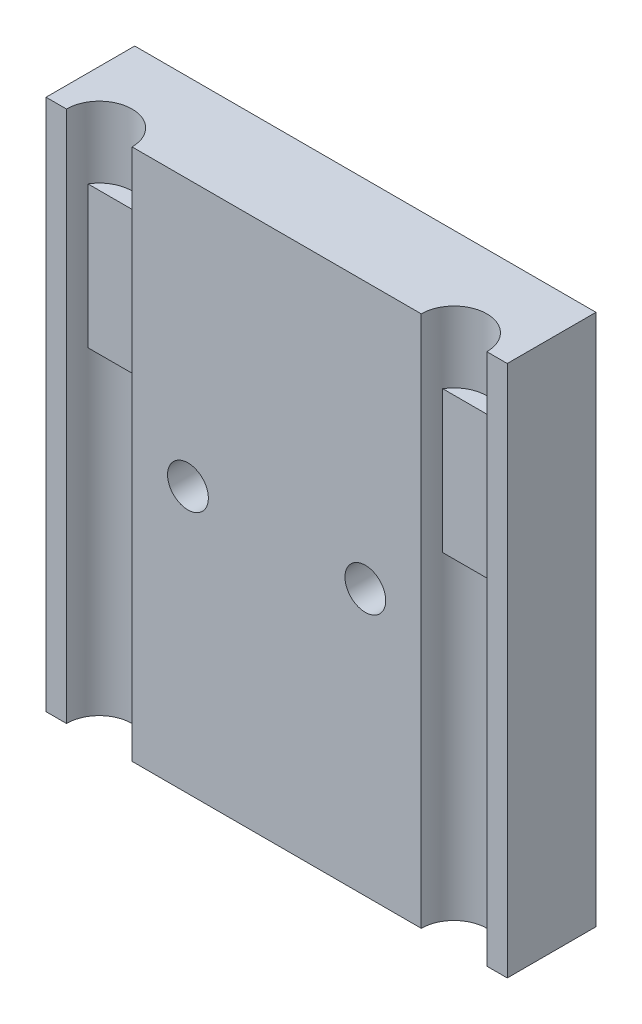
ISO-10303-21;
HEADER;
FILE_DESCRIPTION(('STEP AP214'),'2;1');
FILE_NAME('part.step','',(''),(''),'','','');
FILE_SCHEMA(('AUTOMOTIVE_DESIGN { 1 0 10303 214 1 1 1 1 }'));
ENDSEC;
DATA;
#1=APPLICATION_CONTEXT('core data for automotive mechanical design processes');
#2=APPLICATION_PROTOCOL_DEFINITION('international standard','automotive_design',2000,#1);
#3=PRODUCT_CONTEXT('',#1,'mechanical');
#4=PRODUCT('Part','Part','',(#3));
#5=PRODUCT_RELATED_PRODUCT_CATEGORY('part','',(#4));
#6=PRODUCT_DEFINITION_FORMATION('','',#4);
#7=PRODUCT_DEFINITION_CONTEXT('part definition',#1,'design');
#8=PRODUCT_DEFINITION('design','',#6,#7);
#9=PRODUCT_DEFINITION_SHAPE('','',#8);
#10=(LENGTH_UNIT() NAMED_UNIT(*) SI_UNIT(.MILLI.,.METRE.));
#11=(NAMED_UNIT(*) PLANE_ANGLE_UNIT() SI_UNIT($,.RADIAN.));
#12=(NAMED_UNIT(*) SI_UNIT($,.STERADIAN.) SOLID_ANGLE_UNIT());
#13=UNCERTAINTY_MEASURE_WITH_UNIT(LENGTH_MEASURE(1.E-05),#10,'distance_accuracy_value','');
#14=(GEOMETRIC_REPRESENTATION_CONTEXT(3) GLOBAL_UNCERTAINTY_ASSIGNED_CONTEXT((#13)) GLOBAL_UNIT_ASSIGNED_CONTEXT((#10,
#11,#12)) REPRESENTATION_CONTEXT('',''));
#15=CARTESIAN_POINT('',(0.,0.,0.));
#16=DIRECTION('',(0.,0.,1.));
#17=DIRECTION('',(1.,0.,0.));
#18=AXIS2_PLACEMENT_3D('',#15,#16,#17);
#19=CARTESIAN_POINT('',(0.,0.,5.));
#20=DIRECTION('',(0.,0.,1.));
#21=DIRECTION('',(1.,0.,0.));
#22=AXIS2_PLACEMENT_3D('',#19,#20,#21);
#23=PLANE('',#22);
#24=CARTESIAN_POINT('',(18.,-15.,5.));
#25=DIRECTION('',(0.,0.,1.));
#26=DIRECTION('',(1.,0.,0.));
#27=AXIS2_PLACEMENT_3D('',#24,#25,#26);
#28=CIRCLE('',#27,1.15);
#29=CARTESIAN_POINT('',(19.15,-15.,5.));
#30=VERTEX_POINT('',#29);
#31=EDGE_CURVE('E154',#30,#30,#28,.T.);
#32=ORIENTED_EDGE('',*,*,#31,.F.);
#33=EDGE_LOOP('',(#32));
#34=FACE_BOUND('',#33,.T.);
#35=CARTESIAN_POINT('',(8.,-15.,5.));
#36=DIRECTION('',(0.,0.,1.));
#37=DIRECTION('',(1.,0.,0.));
#38=AXIS2_PLACEMENT_3D('',#35,#36,#37);
#39=CIRCLE('',#38,1.15);
#40=CARTESIAN_POINT('',(9.15,-15.,5.));
#41=VERTEX_POINT('',#40);
#42=EDGE_CURVE('E289',#41,#41,#39,.T.);
#43=ORIENTED_EDGE('',*,*,#42,.F.);
#44=EDGE_LOOP('',(#43));
#45=FACE_BOUND('',#44,.T.);
#46=DIRECTION('',(0.,1.,0.));
#47=VECTOR('',#46,1.);
#48=CARTESIAN_POINT('',(4.85,-12.,5.));
#49=LINE('',#48,#47);
#50=CARTESIAN_POINT('',(4.85,-30.,5.));
#51=VERTEX_POINT('',#50);
#52=CARTESIAN_POINT('',(4.85,0.,5.));
#53=VERTEX_POINT('',#52);
#54=EDGE_CURVE('E11',#51,#53,#49,.T.);
#55=ORIENTED_EDGE('',*,*,#54,.F.);
#56=DIRECTION('',(1.,0.,0.));
#57=VECTOR('',#56,1.);
#58=CARTESIAN_POINT('',(0.,-30.,5.));
#59=LINE('',#58,#57);
#60=CARTESIAN_POINT('',(21.15,-30.,5.));
#61=VERTEX_POINT('',#60);
#62=EDGE_CURVE('E186',#51,#61,#59,.T.);
#63=ORIENTED_EDGE('',*,*,#62,.T.);
#64=DIRECTION('',(0.,1.,0.));
#65=VECTOR('',#64,1.);
#66=CARTESIAN_POINT('',(21.15,-12.,5.));
#67=LINE('',#66,#65);
#68=CARTESIAN_POINT('',(21.15,0.,5.));
#69=VERTEX_POINT('',#68);
#70=EDGE_CURVE('E206',#69,#61,#67,.F.);
#71=ORIENTED_EDGE('',*,*,#70,.F.);
#72=DIRECTION('',(-1.,0.,0.));
#73=VECTOR('',#72,1.);
#74=CARTESIAN_POINT('',(0.,0.,5.));
#75=LINE('',#74,#73);
#76=EDGE_CURVE('E192',#69,#53,#75,.T.);
#77=ORIENTED_EDGE('',*,*,#76,.T.);
#78=EDGE_LOOP('',(#55,#63,#71,#77));
#79=FACE_BOUND('',#78,.T.);
#80=ADVANCED_FACE('F35',(#34,#45,#79),#23,.T.);
#81=DIRECTION('',(0.,1.,0.));
#82=VECTOR('',#81,1.);
#83=CARTESIAN_POINT('',(24.85,-12.,5.));
#84=LINE('',#83,#82);
#85=CARTESIAN_POINT('',(24.85,-30.,5.));
#86=VERTEX_POINT('',#85);
#87=CARTESIAN_POINT('',(24.85,0.,5.));
#88=VERTEX_POINT('',#87);
#89=EDGE_CURVE('E208',#86,#88,#84,.T.);
#90=ORIENTED_EDGE('',*,*,#89,.F.);
#91=CARTESIAN_POINT('',(26.,-30.,5.));
#92=VERTEX_POINT('',#91);
#93=EDGE_CURVE('E183',#86,#92,#59,.T.);
#94=ORIENTED_EDGE('',*,*,#93,.T.);
#95=DIRECTION('',(0.,1.,0.));
#96=VECTOR('',#95,1.);
#97=CARTESIAN_POINT('',(26.,0.,5.));
#98=LINE('',#97,#96);
#99=CARTESIAN_POINT('',(26.,0.,5.));
#100=VERTEX_POINT('',#99);
#101=EDGE_CURVE('E185',#92,#100,#98,.T.);
#102=ORIENTED_EDGE('',*,*,#101,.T.);
#103=EDGE_CURVE('E188',#100,#88,#75,.T.);
#104=ORIENTED_EDGE('',*,*,#103,.T.);
#105=EDGE_LOOP('',(#90,#94,#102,#104));
#106=FACE_BOUND('',#105,.T.);
#107=ADVANCED_FACE('F243',(#106),#23,.T.);
#108=CARTESIAN_POINT('',(23.,-12.,5.));
#109=DIRECTION('',(0.,1.,0.));
#110=DIRECTION('',(0.,0.,1.));
#111=AXIS2_PLACEMENT_3D('',#108,#109,#110);
#112=CYLINDRICAL_SURFACE('',#111,1.85);
#113=DIRECTION('',(0.,-1.,0.));
#114=VECTOR('',#113,1.);
#115=CARTESIAN_POINT('',(24.5874507866388,-4.,4.05));
#116=LINE('',#115,#114);
#117=CARTESIAN_POINT('',(24.5874507866388,-4.,4.05));
#118=VERTEX_POINT('',#117);
#119=CARTESIAN_POINT('',(24.5874507866388,-12.,4.05));
#120=VERTEX_POINT('',#119);
#121=EDGE_CURVE('E152',#118,#120,#116,.T.);
#122=ORIENTED_EDGE('',*,*,#121,.T.);
#123=CARTESIAN_POINT('',(23.,-12.,5.));
#124=DIRECTION('',(0.,1.,0.));
#125=DIRECTION('',(0.,0.,1.));
#126=AXIS2_PLACEMENT_3D('',#123,#124,#125);
#127=CIRCLE('',#126,1.85);
#128=CARTESIAN_POINT('',(21.4125492133612,-12.,4.05));
#129=VERTEX_POINT('',#128);
#130=EDGE_CURVE('E138',#120,#129,#127,.T.);
#131=ORIENTED_EDGE('',*,*,#130,.T.);
#132=DIRECTION('',(0.,-1.,0.));
#133=VECTOR('',#132,1.);
#134=CARTESIAN_POINT('',(21.4125492133612,-4.,4.05));
#135=LINE('',#134,#133);
#136=CARTESIAN_POINT('',(21.4125492133612,-4.,4.05));
#137=VERTEX_POINT('',#136);
#138=EDGE_CURVE('E151',#137,#129,#135,.T.);
#139=ORIENTED_EDGE('',*,*,#138,.F.);
#140=CARTESIAN_POINT('',(23.,-4.,5.));
#141=DIRECTION('',(0.,1.,0.));
#142=DIRECTION('',(0.,0.,1.));
#143=AXIS2_PLACEMENT_3D('',#140,#141,#142);
#144=CIRCLE('',#143,1.85);
#145=EDGE_CURVE('E143',#118,#137,#144,.T.);
#146=ORIENTED_EDGE('',*,*,#145,.F.);
#147=EDGE_LOOP('',(#122,#131,#139,#146));
#148=FACE_BOUND('',#147,.T.);
#149=CARTESIAN_POINT('',(23.,-30.,5.));
#150=DIRECTION('',(0.,1.,0.));
#151=DIRECTION('',(0.,0.,1.));
#152=AXIS2_PLACEMENT_3D('',#149,#150,#151);
#153=CIRCLE('',#152,1.85);
#154=EDGE_CURVE('E153',#86,#61,#153,.T.);
#155=ORIENTED_EDGE('',*,*,#154,.F.);
#156=ORIENTED_EDGE('',*,*,#89,.T.);
#157=CARTESIAN_POINT('',(23.,0.,5.));
#158=DIRECTION('',(0.,1.,0.));
#159=DIRECTION('',(0.,0.,1.));
#160=AXIS2_PLACEMENT_3D('',#157,#158,#159);
#161=CIRCLE('',#160,1.85);
#162=EDGE_CURVE('E176',#88,#69,#161,.T.);
#163=ORIENTED_EDGE('',*,*,#162,.T.);
#164=ORIENTED_EDGE('',*,*,#70,.T.);
#165=EDGE_LOOP('',(#155,#156,#163,#164));
#166=FACE_BOUND('',#165,.T.);
#167=ADVANCED_FACE('F148',(#148,#166),#112,.F.);
#168=CARTESIAN_POINT('',(3.,-12.,5.));
#169=DIRECTION('',(0.,1.,0.));
#170=DIRECTION('',(0.,0.,1.));
#171=AXIS2_PLACEMENT_3D('',#168,#169,#170);
#172=CYLINDRICAL_SURFACE('',#171,1.85);
#173=DIRECTION('',(0.,-1.,0.));
#174=VECTOR('',#173,1.);
#175=CARTESIAN_POINT('',(4.58745078663875,-4.,4.05));
#176=LINE('',#175,#174);
#177=CARTESIAN_POINT('',(4.58745078663875,-4.,4.05));
#178=VERTEX_POINT('',#177);
#179=CARTESIAN_POINT('',(4.58745078663875,-12.,4.05));
#180=VERTEX_POINT('',#179);
#181=EDGE_CURVE('E169',#178,#180,#176,.T.);
#182=ORIENTED_EDGE('',*,*,#181,.T.);
#183=CARTESIAN_POINT('',(3.,-12.,5.));
#184=DIRECTION('',(0.,1.,0.));
#185=DIRECTION('',(0.,0.,1.));
#186=AXIS2_PLACEMENT_3D('',#183,#184,#185);
#187=CIRCLE('',#186,1.85);
#188=CARTESIAN_POINT('',(1.41254921336125,-12.,4.05));
#189=VERTEX_POINT('',#188);
#190=EDGE_CURVE('E217',#180,#189,#187,.T.);
#191=ORIENTED_EDGE('',*,*,#190,.T.);
#192=DIRECTION('',(0.,-1.,0.));
#193=VECTOR('',#192,1.);
#194=CARTESIAN_POINT('',(1.41254921336125,-4.,4.05));
#195=LINE('',#194,#193);
#196=CARTESIAN_POINT('',(1.41254921336125,-4.,4.05));
#197=VERTEX_POINT('',#196);
#198=EDGE_CURVE('E173',#197,#189,#195,.T.);
#199=ORIENTED_EDGE('',*,*,#198,.F.);
#200=CARTESIAN_POINT('',(3.,-4.,5.));
#201=DIRECTION('',(0.,1.,0.));
#202=DIRECTION('',(0.,0.,1.));
#203=AXIS2_PLACEMENT_3D('',#200,#201,#202);
#204=CIRCLE('',#203,1.85);
#205=EDGE_CURVE('E162',#178,#197,#204,.T.);
#206=ORIENTED_EDGE('',*,*,#205,.F.);
#207=EDGE_LOOP('',(#182,#191,#199,#206));
#208=FACE_BOUND('',#207,.T.);
#209=CARTESIAN_POINT('',(3.,-30.,5.));
#210=DIRECTION('',(0.,1.,0.));
#211=DIRECTION('',(0.,0.,1.));
#212=AXIS2_PLACEMENT_3D('',#209,#210,#211);
#213=CIRCLE('',#212,1.85);
#214=CARTESIAN_POINT('',(1.15,-30.,5.));
#215=VERTEX_POINT('',#214);
#216=EDGE_CURVE('E144',#51,#215,#213,.T.);
#217=ORIENTED_EDGE('',*,*,#216,.F.);
#218=ORIENTED_EDGE('',*,*,#54,.T.);
#219=CARTESIAN_POINT('',(3.,0.,5.));
#220=DIRECTION('',(0.,1.,0.));
#221=DIRECTION('',(0.,0.,1.));
#222=AXIS2_PLACEMENT_3D('',#219,#220,#221);
#223=CIRCLE('',#222,1.85);
#224=CARTESIAN_POINT('',(1.15,0.,5.));
#225=VERTEX_POINT('',#224);
#226=EDGE_CURVE('E177',#53,#225,#223,.T.);
#227=ORIENTED_EDGE('',*,*,#226,.T.);
#228=DIRECTION('',(0.,1.,0.));
#229=VECTOR('',#228,1.);
#230=CARTESIAN_POINT('',(1.15,-12.,5.));
#231=LINE('',#230,#229);
#232=EDGE_CURVE('E44',#225,#215,#231,.F.);
#233=ORIENTED_EDGE('',*,*,#232,.T.);
#234=EDGE_LOOP('',(#217,#218,#227,#233));
#235=FACE_BOUND('',#234,.T.);
#236=ADVANCED_FACE('F211',(#208,#235),#172,.F.);
#237=CARTESIAN_POINT('',(0.,0.,5.));
#238=DIRECTION('',(1.,0.,0.));
#239=DIRECTION('',(0.,1.,0.));
#240=AXIS2_PLACEMENT_3D('',#237,#238,#239);
#241=PLANE('',#240);
#242=DIRECTION('',(0.,-1.,0.));
#243=VECTOR('',#242,1.);
#244=CARTESIAN_POINT('',(0.,0.,0.));
#245=LINE('',#244,#243);
#246=CARTESIAN_POINT('',(0.,0.,0.));
#247=VERTEX_POINT('',#246);
#248=CARTESIAN_POINT('',(0.,-30.,0.));
#249=VERTEX_POINT('',#248);
#250=EDGE_CURVE('E179',#247,#249,#245,.T.);
#251=ORIENTED_EDGE('',*,*,#250,.T.);
#252=DIRECTION('',(0.,0.,-1.));
#253=VECTOR('',#252,1.);
#254=CARTESIAN_POINT('',(0.,-30.,5.));
#255=LINE('',#254,#253);
#256=CARTESIAN_POINT('',(0.,-30.,5.));
#257=VERTEX_POINT('',#256);
#258=EDGE_CURVE('E204',#257,#249,#255,.T.);
#259=ORIENTED_EDGE('',*,*,#258,.F.);
#260=DIRECTION('',(0.,-1.,0.));
#261=VECTOR('',#260,1.);
#262=CARTESIAN_POINT('',(0.,0.,5.));
#263=LINE('',#262,#261);
#264=CARTESIAN_POINT('',(0.,0.,5.));
#265=VERTEX_POINT('',#264);
#266=EDGE_CURVE('E181',#265,#257,#263,.T.);
#267=ORIENTED_EDGE('',*,*,#266,.F.);
#268=DIRECTION('',(0.,0.,-1.));
#269=VECTOR('',#268,1.);
#270=CARTESIAN_POINT('',(0.,0.,5.));
#271=LINE('',#270,#269);
#272=EDGE_CURVE('E191',#265,#247,#271,.T.);
#273=ORIENTED_EDGE('',*,*,#272,.T.);
#274=EDGE_LOOP('',(#251,#259,#267,#273));
#275=FACE_BOUND('',#274,.T.);
#276=ADVANCED_FACE('F37',(#275),#241,.F.);
#277=CARTESIAN_POINT('',(0.,-30.,5.));
#278=DIRECTION('',(0.,1.,0.));
#279=DIRECTION('',(0.,0.,1.));
#280=AXIS2_PLACEMENT_3D('',#277,#278,#279);
#281=PLANE('',#280);
#282=ORIENTED_EDGE('',*,*,#62,.F.);
#283=ORIENTED_EDGE('',*,*,#216,.T.);
#284=EDGE_CURVE('E85',#257,#215,#59,.T.);
#285=ORIENTED_EDGE('',*,*,#284,.F.);
#286=ORIENTED_EDGE('',*,*,#258,.T.);
#287=DIRECTION('',(1.,0.,0.));
#288=VECTOR('',#287,1.);
#289=CARTESIAN_POINT('',(0.,-30.,0.));
#290=LINE('',#289,#288);
#291=CARTESIAN_POINT('',(26.,-30.,0.));
#292=VERTEX_POINT('',#291);
#293=EDGE_CURVE('E195',#249,#292,#290,.T.);
#294=ORIENTED_EDGE('',*,*,#293,.T.);
#295=DIRECTION('',(0.,0.,-1.));
#296=VECTOR('',#295,1.);
#297=CARTESIAN_POINT('',(26.,-30.,5.));
#298=LINE('',#297,#296);
#299=EDGE_CURVE('E202',#92,#292,#298,.T.);
#300=ORIENTED_EDGE('',*,*,#299,.F.);
#301=ORIENTED_EDGE('',*,*,#93,.F.);
#302=ORIENTED_EDGE('',*,*,#154,.T.);
#303=EDGE_LOOP('',(#282,#283,#285,#286,#294,#300,#301,#302));
#304=FACE_BOUND('',#303,.T.);
#305=ADVANCED_FACE('F214',(#304),#281,.F.);
#306=CARTESIAN_POINT('',(26.,0.,5.));
#307=DIRECTION('',(-1.,0.,0.));
#308=DIRECTION('',(0.,-1.,0.));
#309=AXIS2_PLACEMENT_3D('',#306,#307,#308);
#310=PLANE('',#309);
#311=DIRECTION('',(0.,1.,0.));
#312=VECTOR('',#311,1.);
#313=CARTESIAN_POINT('',(26.,0.,0.));
#314=LINE('',#313,#312);
#315=CARTESIAN_POINT('',(26.,0.,0.));
#316=VERTEX_POINT('',#315);
#317=EDGE_CURVE('E71',#292,#316,#314,.T.);
#318=ORIENTED_EDGE('',*,*,#317,.T.);
#319=DIRECTION('',(0.,0.,-1.));
#320=VECTOR('',#319,1.);
#321=CARTESIAN_POINT('',(26.,0.,5.));
#322=LINE('',#321,#320);
#323=EDGE_CURVE('E200',#100,#316,#322,.T.);
#324=ORIENTED_EDGE('',*,*,#323,.F.);
#325=ORIENTED_EDGE('',*,*,#101,.F.);
#326=ORIENTED_EDGE('',*,*,#299,.T.);
#327=EDGE_LOOP('',(#318,#324,#325,#326));
#328=FACE_BOUND('',#327,.T.);
#329=ADVANCED_FACE('F228',(#328),#310,.F.);
#330=CARTESIAN_POINT('',(0.,0.,5.));
#331=DIRECTION('',(0.,-1.,0.));
#332=DIRECTION('',(0.,0.,-1.));
#333=AXIS2_PLACEMENT_3D('',#330,#331,#332);
#334=PLANE('',#333);
#335=EDGE_CURVE('E52',#225,#265,#75,.T.);
#336=ORIENTED_EDGE('',*,*,#335,.F.);
#337=ORIENTED_EDGE('',*,*,#226,.F.);
#338=ORIENTED_EDGE('',*,*,#76,.F.);
#339=ORIENTED_EDGE('',*,*,#162,.F.);
#340=ORIENTED_EDGE('',*,*,#103,.F.);
#341=ORIENTED_EDGE('',*,*,#323,.T.);
#342=DIRECTION('',(-1.,0.,0.));
#343=VECTOR('',#342,1.);
#344=CARTESIAN_POINT('',(0.,0.,0.));
#345=LINE('',#344,#343);
#346=EDGE_CURVE('E77',#316,#247,#345,.T.);
#347=ORIENTED_EDGE('',*,*,#346,.T.);
#348=ORIENTED_EDGE('',*,*,#272,.F.);
#349=EDGE_LOOP('',(#336,#337,#338,#339,#340,#341,#347,#348));
#350=FACE_BOUND('',#349,.T.);
#351=ADVANCED_FACE('F241',(#350),#334,.F.);
#352=ORIENTED_EDGE('',*,*,#284,.T.);
#353=ORIENTED_EDGE('',*,*,#232,.F.);
#354=ORIENTED_EDGE('',*,*,#335,.T.);
#355=ORIENTED_EDGE('',*,*,#266,.T.);
#356=EDGE_LOOP('',(#352,#353,#354,#355));
#357=FACE_BOUND('',#356,.T.);
#358=ADVANCED_FACE('F219',(#357),#23,.T.);
#359=CARTESIAN_POINT('',(0.,0.,0.));
#360=DIRECTION('',(0.,0.,1.));
#361=DIRECTION('',(1.,0.,0.));
#362=AXIS2_PLACEMENT_3D('',#359,#360,#361);
#363=PLANE('',#362);
#364=CARTESIAN_POINT('',(18.,-15.,0.));
#365=DIRECTION('',(0.,0.,-1.));
#366=DIRECTION('',(-1.,0.,0.));
#367=AXIS2_PLACEMENT_3D('',#364,#365,#366);
#368=CIRCLE('',#367,1.15);
#369=CARTESIAN_POINT('',(16.85,-15.,0.));
#370=VERTEX_POINT('',#369);
#371=EDGE_CURVE('E288',#370,#370,#368,.T.);
#372=ORIENTED_EDGE('',*,*,#371,.F.);
#373=EDGE_LOOP('',(#372));
#374=FACE_BOUND('',#373,.T.);
#375=CARTESIAN_POINT('',(8.,-15.,0.));
#376=DIRECTION('',(0.,0.,-1.));
#377=DIRECTION('',(-1.,0.,0.));
#378=AXIS2_PLACEMENT_3D('',#375,#376,#377);
#379=CIRCLE('',#378,1.15);
#380=CARTESIAN_POINT('',(6.85,-15.,0.));
#381=VERTEX_POINT('',#380);
#382=EDGE_CURVE('E290',#381,#381,#379,.T.);
#383=ORIENTED_EDGE('',*,*,#382,.F.);
#384=EDGE_LOOP('',(#383));
#385=FACE_BOUND('',#384,.T.);
#386=ORIENTED_EDGE('',*,*,#250,.F.);
#387=ORIENTED_EDGE('',*,*,#346,.F.);
#388=ORIENTED_EDGE('',*,*,#317,.F.);
#389=ORIENTED_EDGE('',*,*,#293,.F.);
#390=EDGE_LOOP('',(#386,#387,#388,#389));
#391=FACE_BOUND('',#390,.T.);
#392=ADVANCED_FACE('F229',(#374,#385,#391),#363,.F.);
#393=CARTESIAN_POINT('',(1.41254921336125,-4.,4.05));
#394=DIRECTION('',(0.,0.,-1.));
#395=DIRECTION('',(-1.,0.,0.));
#396=AXIS2_PLACEMENT_3D('',#393,#394,#395);
#397=PLANE('',#396);
#398=DIRECTION('',(1.,0.,0.));
#399=VECTOR('',#398,1.);
#400=CARTESIAN_POINT('',(1.41254921336125,-12.,4.05));
#401=LINE('',#400,#399);
#402=EDGE_CURVE('E159',#189,#180,#401,.T.);
#403=ORIENTED_EDGE('',*,*,#402,.T.);
#404=ORIENTED_EDGE('',*,*,#181,.F.);
#405=DIRECTION('',(1.,0.,0.));
#406=VECTOR('',#405,1.);
#407=CARTESIAN_POINT('',(1.41254921336125,-4.,4.05));
#408=LINE('',#407,#406);
#409=EDGE_CURVE('E168',#197,#178,#408,.T.);
#410=ORIENTED_EDGE('',*,*,#409,.F.);
#411=ORIENTED_EDGE('',*,*,#198,.T.);
#412=EDGE_LOOP('',(#403,#404,#410,#411));
#413=FACE_BOUND('',#412,.T.);
#414=ADVANCED_FACE('F231',(#413),#397,.F.);
#415=CARTESIAN_POINT('',(3.,-4.,5.));
#416=DIRECTION('',(0.,1.,0.));
#417=DIRECTION('',(0.,0.,1.));
#418=AXIS2_PLACEMENT_3D('',#415,#416,#417);
#419=PLANE('',#418);
#420=ORIENTED_EDGE('',*,*,#205,.T.);
#421=ORIENTED_EDGE('',*,*,#409,.T.);
#422=EDGE_LOOP('',(#420,#421));
#423=FACE_BOUND('',#422,.T.);
#424=ADVANCED_FACE('F238',(#423),#419,.T.);
#425=CARTESIAN_POINT('',(21.4125492133612,-4.,4.05));
#426=DIRECTION('',(0.,0.,-1.));
#427=DIRECTION('',(-1.,0.,0.));
#428=AXIS2_PLACEMENT_3D('',#425,#426,#427);
#429=PLANE('',#428);
#430=DIRECTION('',(1.,0.,0.));
#431=VECTOR('',#430,1.);
#432=CARTESIAN_POINT('',(21.4125492133612,-12.,4.05));
#433=LINE('',#432,#431);
#434=EDGE_CURVE('E135',#129,#120,#433,.T.);
#435=ORIENTED_EDGE('',*,*,#434,.T.);
#436=ORIENTED_EDGE('',*,*,#121,.F.);
#437=DIRECTION('',(1.,0.,0.));
#438=VECTOR('',#437,1.);
#439=CARTESIAN_POINT('',(21.4125492133612,-4.,4.05));
#440=LINE('',#439,#438);
#441=EDGE_CURVE('E157',#137,#118,#440,.T.);
#442=ORIENTED_EDGE('',*,*,#441,.F.);
#443=ORIENTED_EDGE('',*,*,#138,.T.);
#444=EDGE_LOOP('',(#435,#436,#442,#443));
#445=FACE_BOUND('',#444,.T.);
#446=ADVANCED_FACE('F156',(#445),#429,.F.);
#447=CARTESIAN_POINT('',(23.,-4.,5.));
#448=DIRECTION('',(0.,1.,0.));
#449=DIRECTION('',(0.,0.,1.));
#450=AXIS2_PLACEMENT_3D('',#447,#448,#449);
#451=PLANE('',#450);
#452=ORIENTED_EDGE('',*,*,#145,.T.);
#453=ORIENTED_EDGE('',*,*,#441,.T.);
#454=EDGE_LOOP('',(#452,#453));
#455=FACE_BOUND('',#454,.T.);
#456=ADVANCED_FACE('F266',(#455),#451,.T.);
#457=CARTESIAN_POINT('',(23.,-12.,5.));
#458=DIRECTION('',(0.,1.,0.));
#459=DIRECTION('',(0.,0.,1.));
#460=AXIS2_PLACEMENT_3D('',#457,#458,#459);
#461=PLANE('',#460);
#462=ORIENTED_EDGE('',*,*,#130,.F.);
#463=ORIENTED_EDGE('',*,*,#434,.F.);
#464=EDGE_LOOP('',(#462,#463));
#465=FACE_BOUND('',#464,.T.);
#466=ADVANCED_FACE('F137',(#465),#461,.F.);
#467=CARTESIAN_POINT('',(3.,-12.,5.));
#468=DIRECTION('',(0.,1.,0.));
#469=DIRECTION('',(0.,0.,1.));
#470=AXIS2_PLACEMENT_3D('',#467,#468,#469);
#471=PLANE('',#470);
#472=ORIENTED_EDGE('',*,*,#190,.F.);
#473=ORIENTED_EDGE('',*,*,#402,.F.);
#474=EDGE_LOOP('',(#472,#473));
#475=FACE_BOUND('',#474,.T.);
#476=ADVANCED_FACE('F272',(#475),#471,.F.);
#477=CARTESIAN_POINT('',(8.,-15.,8.));
#478=DIRECTION('',(0.,0.,-1.));
#479=DIRECTION('',(-1.,0.,0.));
#480=AXIS2_PLACEMENT_3D('',#477,#478,#479);
#481=CYLINDRICAL_SURFACE('',#480,1.15);
#482=ORIENTED_EDGE('',*,*,#42,.T.);
#483=EDGE_LOOP('',(#482));
#484=FACE_BOUND('',#483,.T.);
#485=ORIENTED_EDGE('',*,*,#382,.T.);
#486=EDGE_LOOP('',(#485));
#487=FACE_BOUND('',#486,.T.);
#488=ADVANCED_FACE('F275',(#484,#487),#481,.F.);
#489=CARTESIAN_POINT('',(18.,-15.,8.));
#490=DIRECTION('',(0.,0.,-1.));
#491=DIRECTION('',(-1.,0.,0.));
#492=AXIS2_PLACEMENT_3D('',#489,#490,#491);
#493=CYLINDRICAL_SURFACE('',#492,1.15);
#494=ORIENTED_EDGE('',*,*,#31,.T.);
#495=EDGE_LOOP('',(#494));
#496=FACE_BOUND('',#495,.T.);
#497=ORIENTED_EDGE('',*,*,#371,.T.);
#498=EDGE_LOOP('',(#497));
#499=FACE_BOUND('',#498,.T.);
#500=ADVANCED_FACE('F279',(#496,#499),#493,.F.);
#501=CLOSED_SHELL('',(#80,#107,#167,#236,#276,#305,#329,#351,#358,#392,#414,#424,#446,#456,#466,
#476,#488,#500));
#502=MANIFOLD_SOLID_BREP('B2',#501);
#503=ADVANCED_BREP_SHAPE_REPRESENTATION('',(#18,#502),#14);
#504=SHAPE_DEFINITION_REPRESENTATION(#9,#503);
ENDSEC;
END-ISO-10303-21;
